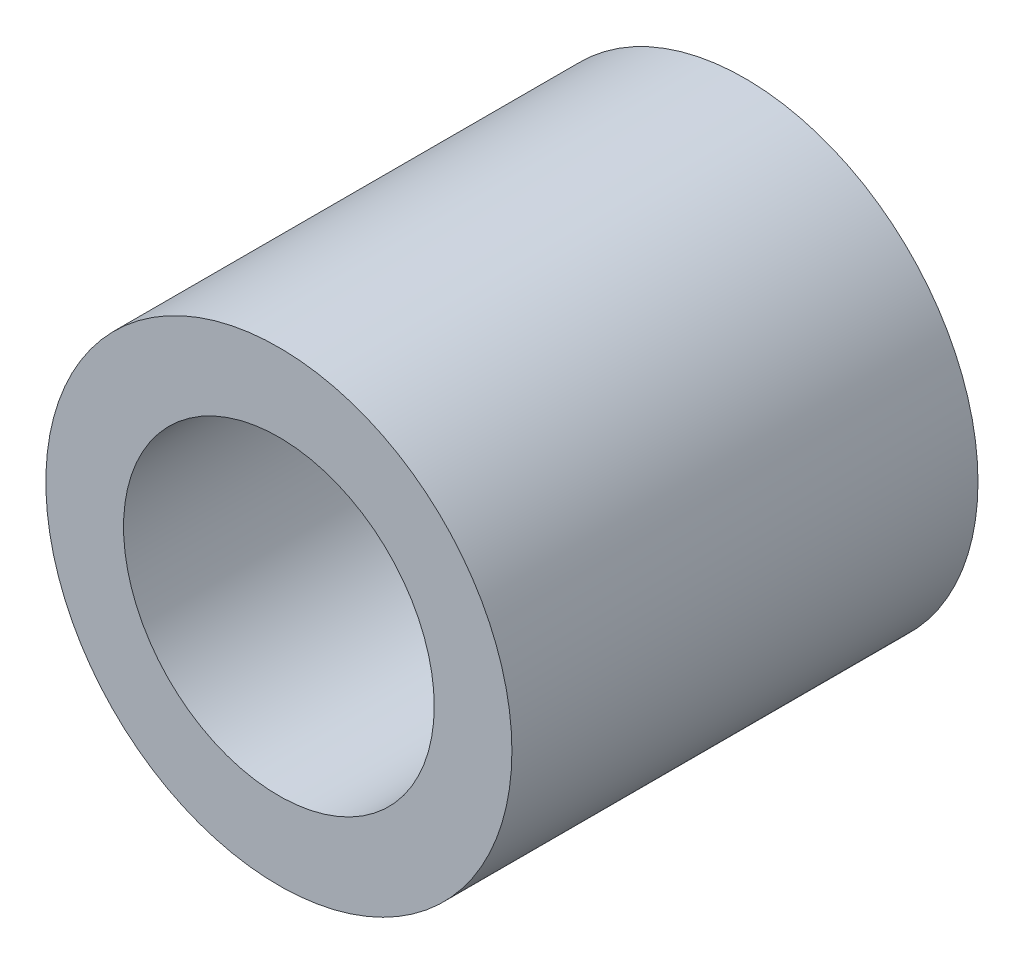
ISO-10303-21;
HEADER;
FILE_DESCRIPTION(('STEP AP214'),'2;1');
FILE_NAME('part.step','',(''),(''),'','','');
FILE_SCHEMA(('AUTOMOTIVE_DESIGN { 1 0 10303 214 1 1 1 1 }'));
ENDSEC;
DATA;
#1=APPLICATION_CONTEXT('core data for automotive mechanical design processes');
#2=APPLICATION_PROTOCOL_DEFINITION('international standard','automotive_design',2000,#1);
#3=PRODUCT_CONTEXT('',#1,'mechanical');
#4=PRODUCT('Part','Part','',(#3));
#5=PRODUCT_RELATED_PRODUCT_CATEGORY('part','',(#4));
#6=PRODUCT_DEFINITION_FORMATION('','',#4);
#7=PRODUCT_DEFINITION_CONTEXT('part definition',#1,'design');
#8=PRODUCT_DEFINITION('design','',#6,#7);
#9=PRODUCT_DEFINITION_SHAPE('','',#8);
#10=(LENGTH_UNIT() NAMED_UNIT(*) SI_UNIT(.MILLI.,.METRE.));
#11=(NAMED_UNIT(*) PLANE_ANGLE_UNIT() SI_UNIT($,.RADIAN.));
#12=(NAMED_UNIT(*) SI_UNIT($,.STERADIAN.) SOLID_ANGLE_UNIT());
#13=UNCERTAINTY_MEASURE_WITH_UNIT(LENGTH_MEASURE(1.E-05),#10,'distance_accuracy_value','');
#14=(GEOMETRIC_REPRESENTATION_CONTEXT(3) GLOBAL_UNCERTAINTY_ASSIGNED_CONTEXT((#13)) GLOBAL_UNIT_ASSIGNED_CONTEXT((#10,
#11,#12)) REPRESENTATION_CONTEXT('',''));
#15=CARTESIAN_POINT('',(0.,0.,0.));
#16=DIRECTION('',(0.,0.,1.));
#17=DIRECTION('',(1.,0.,0.));
#18=AXIS2_PLACEMENT_3D('',#15,#16,#17);
#19=CARTESIAN_POINT('',(0.,0.,9.));
#20=DIRECTION('',(0.,0.,1.));
#21=DIRECTION('',(1.,0.,0.));
#22=AXIS2_PLACEMENT_3D('',#19,#20,#21);
#23=PLANE('',#22);
#24=CARTESIAN_POINT('',(0.,0.,9.));
#25=DIRECTION('',(0.,0.,1.));
#26=DIRECTION('',(1.,0.,0.));
#27=AXIS2_PLACEMENT_3D('',#24,#25,#26);
#28=CIRCLE('',#27,4.5);
#29=CARTESIAN_POINT('',(4.5,0.,9.));
#30=VERTEX_POINT('',#29);
#31=EDGE_CURVE('E10',#30,#30,#28,.T.);
#32=ORIENTED_EDGE('',*,*,#31,.T.);
#33=EDGE_LOOP('',(#32));
#34=FACE_BOUND('',#33,.T.);
#35=CARTESIAN_POINT('',(0.,0.,9.));
#36=DIRECTION('',(0.,0.,1.));
#37=DIRECTION('',(1.,0.,0.));
#38=AXIS2_PLACEMENT_3D('',#35,#36,#37);
#39=CIRCLE('',#38,3.);
#40=CARTESIAN_POINT('',(3.,0.,9.));
#41=VERTEX_POINT('',#40);
#42=EDGE_CURVE('E49',#41,#41,#39,.T.);
#43=ORIENTED_EDGE('',*,*,#42,.F.);
#44=EDGE_LOOP('',(#43));
#45=FACE_BOUND('',#44,.T.);
#46=ADVANCED_FACE('F36',(#34,#45),#23,.T.);
#47=CARTESIAN_POINT('',(0.,0.,0.));
#48=DIRECTION('',(0.,0.,1.));
#49=DIRECTION('',(1.,0.,0.));
#50=AXIS2_PLACEMENT_3D('',#47,#48,#49);
#51=PLANE('',#50);
#52=CARTESIAN_POINT('',(0.,0.,0.));
#53=DIRECTION('',(0.,0.,1.));
#54=DIRECTION('',(1.,0.,0.));
#55=AXIS2_PLACEMENT_3D('',#52,#53,#54);
#56=CIRCLE('',#55,4.5);
#57=CARTESIAN_POINT('',(4.5,0.,0.));
#58=VERTEX_POINT('',#57);
#59=EDGE_CURVE('E40',#58,#58,#56,.T.);
#60=ORIENTED_EDGE('',*,*,#59,.F.);
#61=EDGE_LOOP('',(#60));
#62=FACE_BOUND('',#61,.T.);
#63=CARTESIAN_POINT('',(0.,0.,0.));
#64=DIRECTION('',(0.,0.,1.));
#65=DIRECTION('',(1.,0.,0.));
#66=AXIS2_PLACEMENT_3D('',#63,#64,#65);
#67=CIRCLE('',#66,3.);
#68=CARTESIAN_POINT('',(3.,0.,0.));
#69=VERTEX_POINT('',#68);
#70=EDGE_CURVE('E51',#69,#69,#67,.T.);
#71=ORIENTED_EDGE('',*,*,#70,.T.);
#72=EDGE_LOOP('',(#71));
#73=FACE_BOUND('',#72,.T.);
#74=ADVANCED_FACE('F63',(#62,#73),#51,.F.);
#75=CARTESIAN_POINT('',(0.,0.,9.));
#76=DIRECTION('',(0.,0.,-1.));
#77=DIRECTION('',(-1.,0.,0.));
#78=AXIS2_PLACEMENT_3D('',#75,#76,#77);
#79=CYLINDRICAL_SURFACE('',#78,4.5);
#80=ORIENTED_EDGE('',*,*,#31,.F.);
#81=EDGE_LOOP('',(#80));
#82=FACE_BOUND('',#81,.T.);
#83=ORIENTED_EDGE('',*,*,#59,.T.);
#84=EDGE_LOOP('',(#83));
#85=FACE_BOUND('',#84,.T.);
#86=ADVANCED_FACE('F38',(#82,#85),#79,.T.);
#87=CARTESIAN_POINT('',(0.,0.,9.));
#88=DIRECTION('',(0.,0.,-1.));
#89=DIRECTION('',(-1.,0.,0.));
#90=AXIS2_PLACEMENT_3D('',#87,#88,#89);
#91=CYLINDRICAL_SURFACE('',#90,3.);
#92=ORIENTED_EDGE('',*,*,#42,.T.);
#93=EDGE_LOOP('',(#92));
#94=FACE_BOUND('',#93,.T.);
#95=ORIENTED_EDGE('',*,*,#70,.F.);
#96=EDGE_LOOP('',(#95));
#97=FACE_BOUND('',#96,.T.);
#98=ADVANCED_FACE('F59',(#94,#97),#91,.F.);
#99=CLOSED_SHELL('',(#46,#74,#86,#98));
#100=MANIFOLD_SOLID_BREP('B2',#99);
#101=ADVANCED_BREP_SHAPE_REPRESENTATION('',(#18,#100),#14);
#102=SHAPE_DEFINITION_REPRESENTATION(#9,#101);
ENDSEC;
END-ISO-10303-21;
